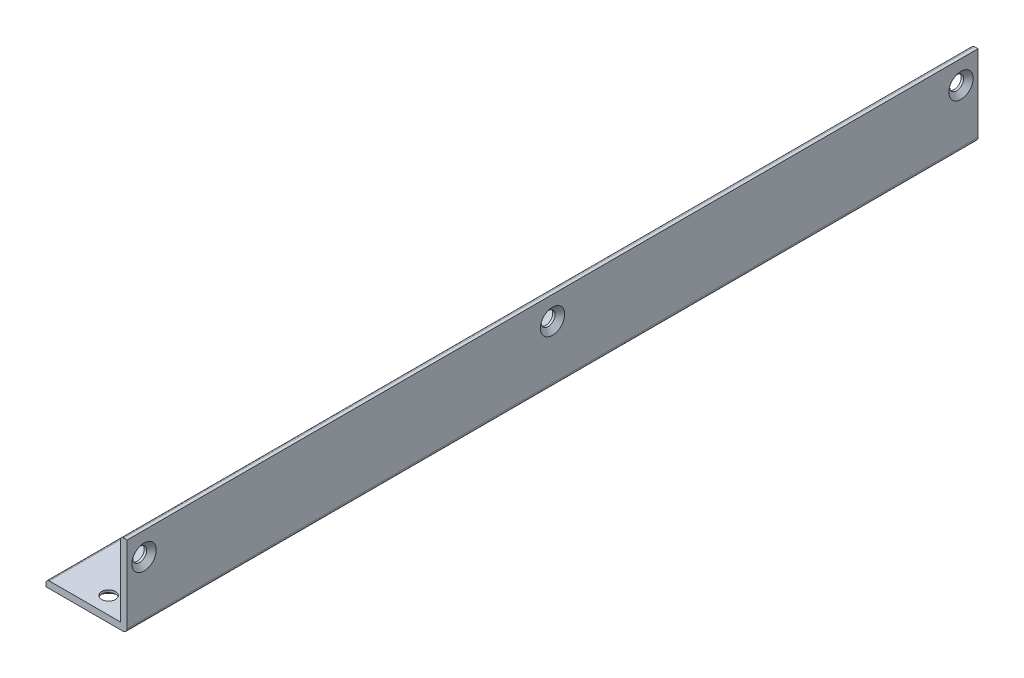
ISO-10303-21;
HEADER;
FILE_DESCRIPTION(('STEP AP214'),'2;1');
FILE_NAME('part.step','',(''),(''),'','','');
FILE_SCHEMA(('AUTOMOTIVE_DESIGN { 1 0 10303 214 1 1 1 1 }'));
ENDSEC;
DATA;
#1=APPLICATION_CONTEXT('core data for automotive mechanical design processes');
#2=APPLICATION_PROTOCOL_DEFINITION('international standard','automotive_design',2000,#1);
#3=PRODUCT_CONTEXT('',#1,'mechanical');
#4=PRODUCT('Part','Part','',(#3));
#5=PRODUCT_RELATED_PRODUCT_CATEGORY('part','',(#4));
#6=PRODUCT_DEFINITION_FORMATION('','',#4);
#7=PRODUCT_DEFINITION_CONTEXT('part definition',#1,'design');
#8=PRODUCT_DEFINITION('design','',#6,#7);
#9=PRODUCT_DEFINITION_SHAPE('','',#8);
#10=(LENGTH_UNIT() NAMED_UNIT(*) SI_UNIT(.MILLI.,.METRE.));
#11=(NAMED_UNIT(*) PLANE_ANGLE_UNIT() SI_UNIT($,.RADIAN.));
#12=(NAMED_UNIT(*) SI_UNIT($,.STERADIAN.) SOLID_ANGLE_UNIT());
#13=UNCERTAINTY_MEASURE_WITH_UNIT(LENGTH_MEASURE(1.E-05),#10,'distance_accuracy_value','');
#14=(GEOMETRIC_REPRESENTATION_CONTEXT(3) GLOBAL_UNCERTAINTY_ASSIGNED_CONTEXT((#13)) GLOBAL_UNIT_ASSIGNED_CONTEXT((#10,
#11,#12)) REPRESENTATION_CONTEXT('',''));
#15=CARTESIAN_POINT('',(0.,0.,0.));
#16=DIRECTION('',(0.,0.,1.));
#17=DIRECTION('',(1.,0.,0.));
#18=AXIS2_PLACEMENT_3D('',#15,#16,#17);
#19=CARTESIAN_POINT('',(8.73125,18.25625,-100.));
#20=DIRECTION('',(0.,0.,-1.));
#21=DIRECTION('',(-1.,0.,0.));
#22=AXIS2_PLACEMENT_3D('',#19,#20,#21);
#23=PLANE('',#22);
#24=DIRECTION('',(-1.,0.,0.));
#25=VECTOR('',#24,1.);
#26=CARTESIAN_POINT('',(7.14375000000001,1.5875,-100.));
#27=LINE('',#26,#25);
#28=CARTESIAN_POINT('',(7.93750000000001,1.5875,-100.));
#29=VERTEX_POINT('',#28);
#30=CARTESIAN_POINT('',(-8.73125,1.5875,-100.));
#31=VERTEX_POINT('',#30);
#32=EDGE_CURVE('E235',#29,#31,#27,.T.);
#33=ORIENTED_EDGE('',*,*,#32,.F.);
#34=DIRECTION('',(0.,-1.,0.));
#35=VECTOR('',#34,1.);
#36=CARTESIAN_POINT('',(7.9375,18.25625,-100.));
#37=LINE('',#36,#35);
#38=CARTESIAN_POINT('',(7.9375,18.25625,-100.));
#39=VERTEX_POINT('',#38);
#40=EDGE_CURVE('E146',#39,#29,#37,.T.);
#41=ORIENTED_EDGE('',*,*,#40,.F.);
#42=CARTESIAN_POINT('',(8.73125,18.25625,-100.));
#43=DIRECTION('',(0.,0.,1.));
#44=DIRECTION('',(-1.,0.,0.));
#45=AXIS2_PLACEMENT_3D('',#42,#43,#44);
#46=CIRCLE('',#45,0.793749999999999);
#47=CARTESIAN_POINT('',(8.73125,19.05,-100.));
#48=VERTEX_POINT('',#47);
#49=EDGE_CURVE('E232',#48,#39,#46,.T.);
#50=ORIENTED_EDGE('',*,*,#49,.F.);
#51=DIRECTION('',(-1.,0.,0.));
#52=VECTOR('',#51,1.);
#53=CARTESIAN_POINT('',(8.73125,19.05,-100.));
#54=LINE('',#53,#52);
#55=CARTESIAN_POINT('',(9.525,19.05,-100.));
#56=VERTEX_POINT('',#55);
#57=EDGE_CURVE('E230',#56,#48,#54,.T.);
#58=ORIENTED_EDGE('',*,*,#57,.F.);
#59=DIRECTION('',(0.,1.,0.));
#60=VECTOR('',#59,1.);
#61=CARTESIAN_POINT('',(9.525,0.,-100.));
#62=LINE('',#61,#60);
#63=CARTESIAN_POINT('',(9.525,1.,-100.));
#64=VERTEX_POINT('',#63);
#65=EDGE_CURVE('E228',#64,#56,#62,.T.);
#66=ORIENTED_EDGE('',*,*,#65,.F.);
#67=CARTESIAN_POINT('',(8.525,1.,-100.));
#68=DIRECTION('',(0.,0.,-1.));
#69=DIRECTION('',(-1.,0.,0.));
#70=AXIS2_PLACEMENT_3D('',#67,#68,#69);
#71=CIRCLE('',#70,1.);
#72=CARTESIAN_POINT('',(8.525,0.,-100.));
#73=VERTEX_POINT('',#72);
#74=EDGE_CURVE('E59',#64,#73,#71,.T.);
#75=ORIENTED_EDGE('',*,*,#74,.T.);
#76=DIRECTION('',(1.,0.,0.));
#77=VECTOR('',#76,1.);
#78=CARTESIAN_POINT('',(-9.525,0.,-100.));
#79=LINE('',#78,#77);
#80=CARTESIAN_POINT('',(-9.525,0.,-100.));
#81=VERTEX_POINT('',#80);
#82=EDGE_CURVE('E226',#81,#73,#79,.T.);
#83=ORIENTED_EDGE('',*,*,#82,.F.);
#84=DIRECTION('',(0.,-1.,0.));
#85=VECTOR('',#84,1.);
#86=CARTESIAN_POINT('',(-9.525,0.793749999999998,-100.));
#87=LINE('',#86,#85);
#88=CARTESIAN_POINT('',(-9.525,0.793749999999998,-100.));
#89=VERTEX_POINT('',#88);
#90=EDGE_CURVE('E223',#89,#81,#87,.T.);
#91=ORIENTED_EDGE('',*,*,#90,.F.);
#92=CARTESIAN_POINT('',(-8.73125,0.793749999999998,-100.));
#93=DIRECTION('',(0.,0.,1.));
#94=DIRECTION('',(-1.,0.,0.));
#95=AXIS2_PLACEMENT_3D('',#92,#93,#94);
#96=CIRCLE('',#95,0.793749999999998);
#97=EDGE_CURVE('E208',#31,#89,#96,.T.);
#98=ORIENTED_EDGE('',*,*,#97,.F.);
#99=EDGE_LOOP('',(#33,#41,#50,#58,#66,#75,#83,#91,#98));
#100=FACE_BOUND('',#99,.T.);
#101=ADVANCED_FACE('F35',(#100),#23,.T.);
#102=CARTESIAN_POINT('',(-9.525,0.793749999999998,100.));
#103=DIRECTION('',(1.,0.,0.));
#104=DIRECTION('',(0.,0.,-1.));
#105=AXIS2_PLACEMENT_3D('',#102,#103,#104);
#106=PLANE('',#105);
#107=ORIENTED_EDGE('',*,*,#90,.T.);
#108=DIRECTION('',(0.,0.,-1.));
#109=VECTOR('',#108,1.);
#110=CARTESIAN_POINT('',(-9.525,0.,100.));
#111=LINE('',#110,#109);
#112=CARTESIAN_POINT('',(-9.525,0.,100.));
#113=VERTEX_POINT('',#112);
#114=EDGE_CURVE('E254',#113,#81,#111,.T.);
#115=ORIENTED_EDGE('',*,*,#114,.F.);
#116=DIRECTION('',(0.,-1.,0.));
#117=VECTOR('',#116,1.);
#118=CARTESIAN_POINT('',(-9.525,0.793749999999998,100.));
#119=LINE('',#118,#117);
#120=CARTESIAN_POINT('',(-9.525,0.793749999999998,100.));
#121=VERTEX_POINT('',#120);
#122=EDGE_CURVE('E204',#121,#113,#119,.T.);
#123=ORIENTED_EDGE('',*,*,#122,.F.);
#124=DIRECTION('',(0.,0.,-1.));
#125=VECTOR('',#124,1.);
#126=CARTESIAN_POINT('',(-9.525,0.793749999999998,100.));
#127=LINE('',#126,#125);
#128=EDGE_CURVE('E222',#121,#89,#127,.T.);
#129=ORIENTED_EDGE('',*,*,#128,.T.);
#130=EDGE_LOOP('',(#107,#115,#123,#129));
#131=FACE_BOUND('',#130,.T.);
#132=ADVANCED_FACE('F289',(#131),#106,.F.);
#133=CARTESIAN_POINT('',(-9.525,0.,100.));
#134=DIRECTION('',(0.,1.,0.));
#135=DIRECTION('',(0.,0.,1.));
#136=AXIS2_PLACEMENT_3D('',#133,#134,#135);
#137=PLANE('',#136);
#138=CARTESIAN_POINT('',(0.275000000000001,0.,0.));
#139=DIRECTION('',(0.,-1.,0.));
#140=DIRECTION('',(0.,0.,-1.));
#141=AXIS2_PLACEMENT_3D('',#138,#139,#140);
#142=CIRCLE('',#141,2.8575);
#143=CARTESIAN_POINT('',(0.275000000000001,0.,-2.8575));
#144=VERTEX_POINT('',#143);
#145=EDGE_CURVE('E169',#144,#144,#142,.T.);
#146=ORIENTED_EDGE('',*,*,#145,.F.);
#147=EDGE_LOOP('',(#146));
#148=FACE_BOUND('',#147,.T.);
#149=CARTESIAN_POINT('',(1.185,0.,96.));
#150=DIRECTION('',(0.,-1.,0.));
#151=DIRECTION('',(0.,0.,-1.));
#152=AXIS2_PLACEMENT_3D('',#149,#150,#151);
#153=CIRCLE('',#152,2.8575);
#154=CARTESIAN_POINT('',(1.185,0.,93.1425));
#155=VERTEX_POINT('',#154);
#156=EDGE_CURVE('E190',#155,#155,#153,.T.);
#157=ORIENTED_EDGE('',*,*,#156,.F.);
#158=EDGE_LOOP('',(#157));
#159=FACE_BOUND('',#158,.T.);
#160=CARTESIAN_POINT('',(0.275000000000001,0.,-96.));
#161=DIRECTION('',(0.,-1.,0.));
#162=DIRECTION('',(0.,0.,-1.));
#163=AXIS2_PLACEMENT_3D('',#160,#161,#162);
#164=CIRCLE('',#163,2.8575);
#165=CARTESIAN_POINT('',(0.275000000000001,0.,-98.8575));
#166=VERTEX_POINT('',#165);
#167=EDGE_CURVE('E197',#166,#166,#164,.T.);
#168=ORIENTED_EDGE('',*,*,#167,.F.);
#169=EDGE_LOOP('',(#168));
#170=FACE_BOUND('',#169,.T.);
#171=ORIENTED_EDGE('',*,*,#82,.T.);
#172=DIRECTION('',(0.,0.,-1.));
#173=VECTOR('',#172,1.);
#174=CARTESIAN_POINT('',(8.525,0.,100.));
#175=LINE('',#174,#173);
#176=CARTESIAN_POINT('',(8.525,0.,100.));
#177=VERTEX_POINT('',#176);
#178=EDGE_CURVE('E44',#73,#177,#175,.F.);
#179=ORIENTED_EDGE('',*,*,#178,.T.);
#180=DIRECTION('',(1.,0.,0.));
#181=VECTOR('',#180,1.);
#182=CARTESIAN_POINT('',(-9.525,0.,100.));
#183=LINE('',#182,#181);
#184=EDGE_CURVE('E207',#113,#177,#183,.T.);
#185=ORIENTED_EDGE('',*,*,#184,.F.);
#186=ORIENTED_EDGE('',*,*,#114,.T.);
#187=EDGE_LOOP('',(#171,#179,#185,#186));
#188=FACE_BOUND('',#187,.T.);
#189=ADVANCED_FACE('F294',(#148,#159,#170,#188),#137,.F.);
#190=CARTESIAN_POINT('',(9.525,0.,100.));
#191=DIRECTION('',(-1.,0.,0.));
#192=DIRECTION('',(0.,0.,1.));
#193=AXIS2_PLACEMENT_3D('',#190,#191,#192);
#194=PLANE('',#193);
#195=CARTESIAN_POINT('',(9.525,13.5875,0.));
#196=DIRECTION('',(1.,0.,0.));
#197=DIRECTION('',(0.,0.,-1.));
#198=AXIS2_PLACEMENT_3D('',#195,#196,#197);
#199=CIRCLE('',#198,2.8575);
#200=CARTESIAN_POINT('',(9.525,13.5875,-2.8575));
#201=VERTEX_POINT('',#200);
#202=EDGE_CURVE('E163',#201,#201,#199,.T.);
#203=ORIENTED_EDGE('',*,*,#202,.F.);
#204=EDGE_LOOP('',(#203));
#205=FACE_BOUND('',#204,.T.);
#206=CARTESIAN_POINT('',(9.525,13.5875,96.));
#207=DIRECTION('',(1.,0.,0.));
#208=DIRECTION('',(0.,0.,-1.));
#209=AXIS2_PLACEMENT_3D('',#206,#207,#208);
#210=CIRCLE('',#209,2.8575);
#211=CARTESIAN_POINT('',(9.525,13.5875,93.1425));
#212=VERTEX_POINT('',#211);
#213=EDGE_CURVE('E176',#212,#212,#210,.T.);
#214=ORIENTED_EDGE('',*,*,#213,.F.);
#215=EDGE_LOOP('',(#214));
#216=FACE_BOUND('',#215,.T.);
#217=CARTESIAN_POINT('',(9.525,13.5875,-96.));
#218=DIRECTION('',(1.,0.,0.));
#219=DIRECTION('',(0.,0.,-1.));
#220=AXIS2_PLACEMENT_3D('',#217,#218,#219);
#221=CIRCLE('',#220,2.8575);
#222=CARTESIAN_POINT('',(9.525,13.5875,-98.8575));
#223=VERTEX_POINT('',#222);
#224=EDGE_CURVE('E183',#223,#223,#221,.T.);
#225=ORIENTED_EDGE('',*,*,#224,.F.);
#226=EDGE_LOOP('',(#225));
#227=FACE_BOUND('',#226,.T.);
#228=DIRECTION('',(0.,1.,0.));
#229=VECTOR('',#228,1.);
#230=CARTESIAN_POINT('',(9.525,0.,100.));
#231=LINE('',#230,#229);
#232=CARTESIAN_POINT('',(9.525,1.,100.));
#233=VERTEX_POINT('',#232);
#234=CARTESIAN_POINT('',(9.525,19.05,100.));
#235=VERTEX_POINT('',#234);
#236=EDGE_CURVE('E210',#233,#235,#231,.T.);
#237=ORIENTED_EDGE('',*,*,#236,.F.);
#238=DIRECTION('',(0.,0.,-1.));
#239=VECTOR('',#238,1.);
#240=CARTESIAN_POINT('',(9.525,1.,100.));
#241=LINE('',#240,#239);
#242=EDGE_CURVE('E257',#233,#64,#241,.T.);
#243=ORIENTED_EDGE('',*,*,#242,.T.);
#244=ORIENTED_EDGE('',*,*,#65,.T.);
#245=DIRECTION('',(0.,0.,-1.));
#246=VECTOR('',#245,1.);
#247=CARTESIAN_POINT('',(9.525,19.05,100.));
#248=LINE('',#247,#246);
#249=EDGE_CURVE('E251',#235,#56,#248,.T.);
#250=ORIENTED_EDGE('',*,*,#249,.F.);
#251=EDGE_LOOP('',(#237,#243,#244,#250));
#252=FACE_BOUND('',#251,.T.);
#253=ADVANCED_FACE('F319',(#205,#216,#227,#252),#194,.F.);
#254=CARTESIAN_POINT('',(8.73125,19.05,100.));
#255=DIRECTION('',(0.,-1.,0.));
#256=DIRECTION('',(0.,0.,-1.));
#257=AXIS2_PLACEMENT_3D('',#254,#255,#256);
#258=PLANE('',#257);
#259=ORIENTED_EDGE('',*,*,#57,.T.);
#260=DIRECTION('',(0.,0.,-1.));
#261=VECTOR('',#260,1.);
#262=CARTESIAN_POINT('',(8.73125,19.05,100.));
#263=LINE('',#262,#261);
#264=CARTESIAN_POINT('',(8.73125,19.05,100.));
#265=VERTEX_POINT('',#264);
#266=EDGE_CURVE('E248',#265,#48,#263,.T.);
#267=ORIENTED_EDGE('',*,*,#266,.F.);
#268=DIRECTION('',(-1.,0.,0.));
#269=VECTOR('',#268,1.);
#270=CARTESIAN_POINT('',(8.73125,19.05,100.));
#271=LINE('',#270,#269);
#272=EDGE_CURVE('E212',#235,#265,#271,.T.);
#273=ORIENTED_EDGE('',*,*,#272,.F.);
#274=ORIENTED_EDGE('',*,*,#249,.T.);
#275=EDGE_LOOP('',(#259,#267,#273,#274));
#276=FACE_BOUND('',#275,.T.);
#277=ADVANCED_FACE('F315',(#276),#258,.F.);
#278=CARTESIAN_POINT('',(8.73125,18.25625,100.));
#279=DIRECTION('',(0.,0.,-1.));
#280=DIRECTION('',(-1.,0.,0.));
#281=AXIS2_PLACEMENT_3D('',#278,#279,#280);
#282=CYLINDRICAL_SURFACE('',#281,0.793749999999999);
#283=ORIENTED_EDGE('',*,*,#49,.T.);
#284=DIRECTION('',(0.,0.,-1.));
#285=VECTOR('',#284,1.);
#286=CARTESIAN_POINT('',(7.9375,18.25625,100.));
#287=LINE('',#286,#285);
#288=CARTESIAN_POINT('',(7.9375,18.25625,100.));
#289=VERTEX_POINT('',#288);
#290=EDGE_CURVE('E246',#289,#39,#287,.T.);
#291=ORIENTED_EDGE('',*,*,#290,.F.);
#292=CARTESIAN_POINT('',(8.73125,18.25625,100.));
#293=DIRECTION('',(0.,0.,1.));
#294=DIRECTION('',(-1.,0.,0.));
#295=AXIS2_PLACEMENT_3D('',#292,#293,#294);
#296=CIRCLE('',#295,0.793749999999999);
#297=EDGE_CURVE('E214',#265,#289,#296,.T.);
#298=ORIENTED_EDGE('',*,*,#297,.F.);
#299=ORIENTED_EDGE('',*,*,#266,.T.);
#300=EDGE_LOOP('',(#283,#291,#298,#299));
#301=FACE_BOUND('',#300,.T.);
#302=ADVANCED_FACE('F312',(#301),#282,.T.);
#303=CARTESIAN_POINT('',(7.9375,18.25625,100.));
#304=DIRECTION('',(1.,0.,0.));
#305=DIRECTION('',(0.,1.,0.));
#306=AXIS2_PLACEMENT_3D('',#303,#304,#305);
#307=PLANE('',#306);
#308=ORIENTED_EDGE('',*,*,#40,.T.);
#309=DIRECTION('',(0.,0.,-1.));
#310=VECTOR('',#309,1.);
#311=CARTESIAN_POINT('',(7.93750000000001,1.5875,-75.));
#312=LINE('',#311,#310);
#313=CARTESIAN_POINT('',(7.93750000000001,1.5875,-75.));
#314=VERTEX_POINT('',#313);
#315=EDGE_CURVE('E128',#314,#29,#312,.T.);
#316=ORIENTED_EDGE('',*,*,#315,.F.);
#317=DIRECTION('',(0.,1.,0.));
#318=VECTOR('',#317,1.);
#319=CARTESIAN_POINT('',(7.93750000000001,6.5875,-75.));
#320=LINE('',#319,#318);
#321=CARTESIAN_POINT('',(7.93750000000001,2.38125,-75.));
#322=VERTEX_POINT('',#321);
#323=EDGE_CURVE('E135',#314,#322,#320,.T.);
#324=ORIENTED_EDGE('',*,*,#323,.T.);
#325=DIRECTION('',(0.,0.,-1.));
#326=VECTOR('',#325,1.);
#327=CARTESIAN_POINT('',(7.93750000000001,2.38125,100.));
#328=LINE('',#327,#326);
#329=CARTESIAN_POINT('',(7.93750000000001,2.38125,75.));
#330=VERTEX_POINT('',#329);
#331=EDGE_CURVE('E244',#330,#322,#328,.T.);
#332=ORIENTED_EDGE('',*,*,#331,.F.);
#333=DIRECTION('',(0.,1.,0.));
#334=VECTOR('',#333,1.);
#335=CARTESIAN_POINT('',(7.93750000000001,6.5875,75.));
#336=LINE('',#335,#334);
#337=CARTESIAN_POINT('',(7.93750000000001,1.5875,75.));
#338=VERTEX_POINT('',#337);
#339=EDGE_CURVE('E155',#338,#330,#336,.T.);
#340=ORIENTED_EDGE('',*,*,#339,.F.);
#341=DIRECTION('',(0.,0.,1.));
#342=VECTOR('',#341,1.);
#343=CARTESIAN_POINT('',(7.93750000000001,1.5875,75.));
#344=LINE('',#343,#342);
#345=CARTESIAN_POINT('',(7.93750000000001,1.5875,100.));
#346=VERTEX_POINT('',#345);
#347=EDGE_CURVE('E157',#338,#346,#344,.T.);
#348=ORIENTED_EDGE('',*,*,#347,.T.);
#349=DIRECTION('',(0.,-1.,0.));
#350=VECTOR('',#349,1.);
#351=CARTESIAN_POINT('',(7.9375,18.25625,100.));
#352=LINE('',#351,#350);
#353=EDGE_CURVE('E216',#289,#346,#352,.T.);
#354=ORIENTED_EDGE('',*,*,#353,.F.);
#355=ORIENTED_EDGE('',*,*,#290,.T.);
#356=EDGE_LOOP('',(#308,#316,#324,#332,#340,#348,#354,#355));
#357=FACE_BOUND('',#356,.T.);
#358=CARTESIAN_POINT('',(7.93750000000001,13.5875,-96.));
#359=DIRECTION('',(1.,0.,0.));
#360=DIRECTION('',(0.,1.,0.));
#361=AXIS2_PLACEMENT_3D('',#358,#359,#360);
#362=CIRCLE('',#361,1.63195);
#363=CARTESIAN_POINT('',(7.93750000000001,15.21945,-96.));
#364=VERTEX_POINT('',#363);
#365=EDGE_CURVE('E189',#364,#364,#362,.T.);
#366=ORIENTED_EDGE('',*,*,#365,.T.);
#367=EDGE_LOOP('',(#366));
#368=FACE_BOUND('',#367,.T.);
#369=CARTESIAN_POINT('',(7.93750000000001,13.5875,96.));
#370=DIRECTION('',(1.,0.,0.));
#371=DIRECTION('',(0.,1.,0.));
#372=AXIS2_PLACEMENT_3D('',#369,#370,#371);
#373=CIRCLE('',#372,1.63195);
#374=CARTESIAN_POINT('',(7.93750000000001,15.21945,96.));
#375=VERTEX_POINT('',#374);
#376=EDGE_CURVE('E182',#375,#375,#373,.T.);
#377=ORIENTED_EDGE('',*,*,#376,.T.);
#378=EDGE_LOOP('',(#377));
#379=FACE_BOUND('',#378,.T.);
#380=CARTESIAN_POINT('',(7.93750000000001,13.5875,0.));
#381=DIRECTION('',(1.,0.,0.));
#382=DIRECTION('',(0.,1.,0.));
#383=AXIS2_PLACEMENT_3D('',#380,#381,#382);
#384=CIRCLE('',#383,1.63194999999999);
#385=CARTESIAN_POINT('',(7.93750000000001,15.21945,0.));
#386=VERTEX_POINT('',#385);
#387=EDGE_CURVE('E39',#386,#386,#384,.T.);
#388=ORIENTED_EDGE('',*,*,#387,.T.);
#389=EDGE_LOOP('',(#388));
#390=FACE_BOUND('',#389,.T.);
#391=ADVANCED_FACE('F140',(#357,#368,#379,#390),#307,.F.);
#392=CARTESIAN_POINT('',(7.14375000000001,2.38125,100.));
#393=DIRECTION('',(0.,0.,-1.));
#394=DIRECTION('',(-1.,0.,0.));
#395=AXIS2_PLACEMENT_3D('',#392,#393,#394);
#396=CYLINDRICAL_SURFACE('',#395,0.793749999999999);
#397=ORIENTED_EDGE('',*,*,#331,.T.);
#398=CARTESIAN_POINT('',(7.14375000000001,2.38125,-75.));
#399=DIRECTION('',(0.,0.,1.));
#400=DIRECTION('',(1.,0.,0.));
#401=AXIS2_PLACEMENT_3D('',#398,#399,#400);
#402=CIRCLE('',#401,0.793749999999999);
#403=CARTESIAN_POINT('',(7.14375000000001,1.5875,-75.));
#404=VERTEX_POINT('',#403);
#405=EDGE_CURVE('E147',#322,#404,#402,.F.);
#406=ORIENTED_EDGE('',*,*,#405,.T.);
#407=DIRECTION('',(0.,0.,-1.));
#408=VECTOR('',#407,1.);
#409=CARTESIAN_POINT('',(7.14375000000001,1.5875,100.));
#410=LINE('',#409,#408);
#411=CARTESIAN_POINT('',(7.14375000000001,1.5875,75.));
#412=VERTEX_POINT('',#411);
#413=EDGE_CURVE('E131',#412,#404,#410,.T.);
#414=ORIENTED_EDGE('',*,*,#413,.F.);
#415=CARTESIAN_POINT('',(7.14375000000001,2.38125,75.));
#416=DIRECTION('',(0.,0.,-1.));
#417=DIRECTION('',(-1.,0.,0.));
#418=AXIS2_PLACEMENT_3D('',#415,#416,#417);
#419=CIRCLE('',#418,0.793749999999999);
#420=EDGE_CURVE('E160',#412,#330,#419,.F.);
#421=ORIENTED_EDGE('',*,*,#420,.T.);
#422=EDGE_LOOP('',(#397,#406,#414,#421));
#423=FACE_BOUND('',#422,.T.);
#424=ADVANCED_FACE('F306',(#423),#396,.F.);
#425=CARTESIAN_POINT('',(7.14375000000001,1.5875,100.));
#426=DIRECTION('',(0.,-1.,0.));
#427=DIRECTION('',(1.,0.,0.));
#428=AXIS2_PLACEMENT_3D('',#425,#426,#427);
#429=PLANE('',#428);
#430=ORIENTED_EDGE('',*,*,#32,.T.);
#431=DIRECTION('',(0.,0.,-1.));
#432=VECTOR('',#431,1.);
#433=CARTESIAN_POINT('',(-8.73125,1.5875,100.));
#434=LINE('',#433,#432);
#435=CARTESIAN_POINT('',(-8.73125,1.5875,100.));
#436=VERTEX_POINT('',#435);
#437=EDGE_CURVE('E240',#436,#31,#434,.T.);
#438=ORIENTED_EDGE('',*,*,#437,.F.);
#439=DIRECTION('',(-1.,0.,0.));
#440=VECTOR('',#439,1.);
#441=CARTESIAN_POINT('',(7.14375000000001,1.5875,100.));
#442=LINE('',#441,#440);
#443=EDGE_CURVE('E218',#346,#436,#442,.T.);
#444=ORIENTED_EDGE('',*,*,#443,.F.);
#445=ORIENTED_EDGE('',*,*,#347,.F.);
#446=DIRECTION('',(1.,0.,0.));
#447=VECTOR('',#446,1.);
#448=CARTESIAN_POINT('',(2.9375,1.5875,75.));
#449=LINE('',#448,#447);
#450=EDGE_CURVE('E153',#412,#338,#449,.T.);
#451=ORIENTED_EDGE('',*,*,#450,.F.);
#452=ORIENTED_EDGE('',*,*,#413,.T.);
#453=DIRECTION('',(1.,0.,0.));
#454=VECTOR('',#453,1.);
#455=CARTESIAN_POINT('',(2.9375,1.5875,-75.));
#456=LINE('',#455,#454);
#457=EDGE_CURVE('E124',#404,#314,#456,.T.);
#458=ORIENTED_EDGE('',*,*,#457,.T.);
#459=ORIENTED_EDGE('',*,*,#315,.T.);
#460=EDGE_LOOP('',(#430,#438,#444,#445,#451,#452,#458,#459));
#461=FACE_BOUND('',#460,.T.);
#462=CARTESIAN_POINT('',(0.275000000000001,1.5875,-96.));
#463=DIRECTION('',(0.,-1.,0.));
#464=DIRECTION('',(1.,0.,0.));
#465=AXIS2_PLACEMENT_3D('',#462,#463,#464);
#466=CIRCLE('',#465,1.63195);
#467=CARTESIAN_POINT('',(1.90695,1.5875,-96.));
#468=VERTEX_POINT('',#467);
#469=EDGE_CURVE('E203',#468,#468,#466,.T.);
#470=ORIENTED_EDGE('',*,*,#469,.T.);
#471=EDGE_LOOP('',(#470));
#472=FACE_BOUND('',#471,.T.);
#473=CARTESIAN_POINT('',(1.185,1.5875,96.));
#474=DIRECTION('',(0.,-1.,0.));
#475=DIRECTION('',(1.,0.,0.));
#476=AXIS2_PLACEMENT_3D('',#473,#474,#475);
#477=CIRCLE('',#476,1.63195);
#478=CARTESIAN_POINT('',(2.81695,1.5875,96.));
#479=VERTEX_POINT('',#478);
#480=EDGE_CURVE('E196',#479,#479,#477,.T.);
#481=ORIENTED_EDGE('',*,*,#480,.T.);
#482=EDGE_LOOP('',(#481));
#483=FACE_BOUND('',#482,.T.);
#484=CARTESIAN_POINT('',(0.275000000000001,1.5875,0.));
#485=DIRECTION('',(0.,-1.,0.));
#486=DIRECTION('',(1.,0.,0.));
#487=AXIS2_PLACEMENT_3D('',#484,#485,#486);
#488=CIRCLE('',#487,1.63194999999999);
#489=CARTESIAN_POINT('',(1.90694999999999,1.5875,0.));
#490=VERTEX_POINT('',#489);
#491=EDGE_CURVE('E175',#490,#490,#488,.T.);
#492=ORIENTED_EDGE('',*,*,#491,.T.);
#493=EDGE_LOOP('',(#492));
#494=FACE_BOUND('',#493,.T.);
#495=ADVANCED_FACE('F126',(#461,#472,#483,#494),#429,.F.);
#496=CARTESIAN_POINT('',(-8.73125,0.793749999999998,100.));
#497=DIRECTION('',(0.,0.,-1.));
#498=DIRECTION('',(-1.,0.,0.));
#499=AXIS2_PLACEMENT_3D('',#496,#497,#498);
#500=CYLINDRICAL_SURFACE('',#499,0.793749999999998);
#501=ORIENTED_EDGE('',*,*,#97,.T.);
#502=ORIENTED_EDGE('',*,*,#128,.F.);
#503=CARTESIAN_POINT('',(-8.73125,0.793749999999998,100.));
#504=DIRECTION('',(0.,0.,1.));
#505=DIRECTION('',(-1.,0.,0.));
#506=AXIS2_PLACEMENT_3D('',#503,#504,#505);
#507=CIRCLE('',#506,0.793749999999998);
#508=EDGE_CURVE('E220',#436,#121,#507,.T.);
#509=ORIENTED_EDGE('',*,*,#508,.F.);
#510=ORIENTED_EDGE('',*,*,#437,.T.);
#511=EDGE_LOOP('',(#501,#502,#509,#510));
#512=FACE_BOUND('',#511,.T.);
#513=ADVANCED_FACE('F300',(#512),#500,.T.);
#514=CARTESIAN_POINT('',(8.73125,18.25625,100.));
#515=DIRECTION('',(0.,0.,-1.));
#516=DIRECTION('',(-1.,0.,0.));
#517=AXIS2_PLACEMENT_3D('',#514,#515,#516);
#518=PLANE('',#517);
#519=ORIENTED_EDGE('',*,*,#353,.T.);
#520=ORIENTED_EDGE('',*,*,#443,.T.);
#521=ORIENTED_EDGE('',*,*,#508,.T.);
#522=ORIENTED_EDGE('',*,*,#122,.T.);
#523=ORIENTED_EDGE('',*,*,#184,.T.);
#524=CARTESIAN_POINT('',(8.525,1.,100.));
#525=DIRECTION('',(0.,0.,-1.));
#526=DIRECTION('',(-1.,0.,0.));
#527=AXIS2_PLACEMENT_3D('',#524,#525,#526);
#528=CIRCLE('',#527,1.);
#529=EDGE_CURVE('E11',#177,#233,#528,.F.);
#530=ORIENTED_EDGE('',*,*,#529,.T.);
#531=ORIENTED_EDGE('',*,*,#236,.T.);
#532=ORIENTED_EDGE('',*,*,#272,.T.);
#533=ORIENTED_EDGE('',*,*,#297,.T.);
#534=EDGE_LOOP('',(#519,#520,#521,#522,#523,#530,#531,#532,#533));
#535=FACE_BOUND('',#534,.T.);
#536=ADVANCED_FACE('F298',(#535),#518,.F.);
#537=CARTESIAN_POINT('',(0.275000000000001,0.,-96.));
#538=DIRECTION('',(0.,-1.,0.));
#539=DIRECTION('',(0.,0.,-1.));
#540=AXIS2_PLACEMENT_3D('',#537,#538,#539);
#541=CYLINDRICAL_SURFACE('',#540,1.63195);
#542=CARTESIAN_POINT('',(0.275000000000001,1.02835855298932,-96.));
#543=DIRECTION('',(0.,-1.,0.));
#544=DIRECTION('',(0.,0.,-1.));
#545=AXIS2_PLACEMENT_3D('',#542,#543,#544);
#546=CIRCLE('',#545,1.63195);
#547=CARTESIAN_POINT('',(0.275000000000001,1.02835855298932,-97.63195));
#548=VERTEX_POINT('',#547);
#549=EDGE_CURVE('E200',#548,#548,#546,.T.);
#550=ORIENTED_EDGE('',*,*,#549,.T.);
#551=EDGE_LOOP('',(#550));
#552=FACE_BOUND('',#551,.T.);
#553=ORIENTED_EDGE('',*,*,#469,.F.);
#554=EDGE_LOOP('',(#553));
#555=FACE_BOUND('',#554,.T.);
#556=ADVANCED_FACE('F411',(#552,#555),#541,.F.);
#557=CARTESIAN_POINT('',(0.275000000000001,0.,-96.));
#558=DIRECTION('',(0.,-1.,0.));
#559=DIRECTION('',(0.,0.,-1.));
#560=AXIS2_PLACEMENT_3D('',#557,#558,#559);
#561=CONICAL_SURFACE('',#560,2.8575,0.872664625997165);
#562=ORIENTED_EDGE('',*,*,#549,.F.);
#563=EDGE_LOOP('',(#562));
#564=FACE_BOUND('',#563,.T.);
#565=ORIENTED_EDGE('',*,*,#167,.T.);
#566=EDGE_LOOP('',(#565));
#567=FACE_BOUND('',#566,.T.);
#568=ADVANCED_FACE('F408',(#564,#567),#561,.F.);
#569=CARTESIAN_POINT('',(1.185,0.,96.));
#570=DIRECTION('',(0.,-1.,0.));
#571=DIRECTION('',(0.,0.,-1.));
#572=AXIS2_PLACEMENT_3D('',#569,#570,#571);
#573=CYLINDRICAL_SURFACE('',#572,1.63195);
#574=CARTESIAN_POINT('',(1.185,1.02835855298932,96.));
#575=DIRECTION('',(0.,-1.,0.));
#576=DIRECTION('',(0.,0.,-1.));
#577=AXIS2_PLACEMENT_3D('',#574,#575,#576);
#578=CIRCLE('',#577,1.63195);
#579=CARTESIAN_POINT('',(1.185,1.02835855298932,94.36805));
#580=VERTEX_POINT('',#579);
#581=EDGE_CURVE('E193',#580,#580,#578,.T.);
#582=ORIENTED_EDGE('',*,*,#581,.T.);
#583=EDGE_LOOP('',(#582));
#584=FACE_BOUND('',#583,.T.);
#585=ORIENTED_EDGE('',*,*,#480,.F.);
#586=EDGE_LOOP('',(#585));
#587=FACE_BOUND('',#586,.T.);
#588=ADVANCED_FACE('F404',(#584,#587),#573,.F.);
#589=CARTESIAN_POINT('',(1.185,0.,96.));
#590=DIRECTION('',(0.,-1.,0.));
#591=DIRECTION('',(0.,0.,-1.));
#592=AXIS2_PLACEMENT_3D('',#589,#590,#591);
#593=CONICAL_SURFACE('',#592,2.8575,0.872664625997165);
#594=ORIENTED_EDGE('',*,*,#581,.F.);
#595=EDGE_LOOP('',(#594));
#596=FACE_BOUND('',#595,.T.);
#597=ORIENTED_EDGE('',*,*,#156,.T.);
#598=EDGE_LOOP('',(#597));
#599=FACE_BOUND('',#598,.T.);
#600=ADVANCED_FACE('F397',(#596,#599),#593,.F.);
#601=CARTESIAN_POINT('',(9.525,13.5875,-96.));
#602=DIRECTION('',(1.,0.,0.));
#603=DIRECTION('',(0.,0.,-1.));
#604=AXIS2_PLACEMENT_3D('',#601,#602,#603);
#605=CYLINDRICAL_SURFACE('',#604,1.63195);
#606=CARTESIAN_POINT('',(8.49664144701068,13.5875,-96.));
#607=DIRECTION('',(1.,0.,0.));
#608=DIRECTION('',(0.,0.,-1.));
#609=AXIS2_PLACEMENT_3D('',#606,#607,#608);
#610=CIRCLE('',#609,1.63195);
#611=CARTESIAN_POINT('',(8.49664144701068,13.5875,-97.63195));
#612=VERTEX_POINT('',#611);
#613=EDGE_CURVE('E186',#612,#612,#610,.T.);
#614=ORIENTED_EDGE('',*,*,#613,.T.);
#615=EDGE_LOOP('',(#614));
#616=FACE_BOUND('',#615,.T.);
#617=ORIENTED_EDGE('',*,*,#365,.F.);
#618=EDGE_LOOP('',(#617));
#619=FACE_BOUND('',#618,.T.);
#620=ADVANCED_FACE('F388',(#616,#619),#605,.F.);
#621=CARTESIAN_POINT('',(9.525,13.5875,-96.));
#622=DIRECTION('',(1.,0.,0.));
#623=DIRECTION('',(0.,0.,-1.));
#624=AXIS2_PLACEMENT_3D('',#621,#622,#623);
#625=CONICAL_SURFACE('',#624,2.8575,0.872664625997165);
#626=ORIENTED_EDGE('',*,*,#613,.F.);
#627=EDGE_LOOP('',(#626));
#628=FACE_BOUND('',#627,.T.);
#629=ORIENTED_EDGE('',*,*,#224,.T.);
#630=EDGE_LOOP('',(#629));
#631=FACE_BOUND('',#630,.T.);
#632=ADVANCED_FACE('F385',(#628,#631),#625,.F.);
#633=CARTESIAN_POINT('',(9.525,13.5875,96.));
#634=DIRECTION('',(1.,0.,0.));
#635=DIRECTION('',(0.,0.,-1.));
#636=AXIS2_PLACEMENT_3D('',#633,#634,#635);
#637=CYLINDRICAL_SURFACE('',#636,1.63195);
#638=CARTESIAN_POINT('',(8.49664144701068,13.5875,96.));
#639=DIRECTION('',(1.,0.,0.));
#640=DIRECTION('',(0.,0.,-1.));
#641=AXIS2_PLACEMENT_3D('',#638,#639,#640);
#642=CIRCLE('',#641,1.63195);
#643=CARTESIAN_POINT('',(8.49664144701068,13.5875,94.36805));
#644=VERTEX_POINT('',#643);
#645=EDGE_CURVE('E179',#644,#644,#642,.T.);
#646=ORIENTED_EDGE('',*,*,#645,.T.);
#647=EDGE_LOOP('',(#646));
#648=FACE_BOUND('',#647,.T.);
#649=ORIENTED_EDGE('',*,*,#376,.F.);
#650=EDGE_LOOP('',(#649));
#651=FACE_BOUND('',#650,.T.);
#652=ADVANCED_FACE('F387',(#648,#651),#637,.F.);
#653=CARTESIAN_POINT('',(9.525,13.5875,96.));
#654=DIRECTION('',(1.,0.,0.));
#655=DIRECTION('',(0.,0.,-1.));
#656=AXIS2_PLACEMENT_3D('',#653,#654,#655);
#657=CONICAL_SURFACE('',#656,2.8575,0.872664625997165);
#658=ORIENTED_EDGE('',*,*,#645,.F.);
#659=EDGE_LOOP('',(#658));
#660=FACE_BOUND('',#659,.T.);
#661=ORIENTED_EDGE('',*,*,#213,.T.);
#662=EDGE_LOOP('',(#661));
#663=FACE_BOUND('',#662,.T.);
#664=ADVANCED_FACE('F285',(#660,#663),#657,.F.);
#665=CARTESIAN_POINT('',(8.525,1.,100.));
#666=DIRECTION('',(0.,0.,-1.));
#667=DIRECTION('',(-1.,0.,0.));
#668=AXIS2_PLACEMENT_3D('',#665,#666,#667);
#669=CYLINDRICAL_SURFACE('',#668,1.);
#670=ORIENTED_EDGE('',*,*,#529,.F.);
#671=ORIENTED_EDGE('',*,*,#178,.F.);
#672=ORIENTED_EDGE('',*,*,#74,.F.);
#673=ORIENTED_EDGE('',*,*,#242,.F.);
#674=EDGE_LOOP('',(#670,#671,#672,#673));
#675=FACE_BOUND('',#674,.T.);
#676=ADVANCED_FACE('F37',(#675),#669,.T.);
#677=CARTESIAN_POINT('',(0.275000000000001,0.,0.));
#678=DIRECTION('',(0.,-1.,0.));
#679=DIRECTION('',(0.,0.,-1.));
#680=AXIS2_PLACEMENT_3D('',#677,#678,#679);
#681=CYLINDRICAL_SURFACE('',#680,1.63194999999999);
#682=CARTESIAN_POINT('',(0.275000000000001,1.02835855298933,0.));
#683=DIRECTION('',(0.,-1.,0.));
#684=DIRECTION('',(0.,0.,-1.));
#685=AXIS2_PLACEMENT_3D('',#682,#683,#684);
#686=CIRCLE('',#685,1.63194999999999);
#687=CARTESIAN_POINT('',(0.275000000000001,1.02835855298933,-1.63194999999999));
#688=VERTEX_POINT('',#687);
#689=EDGE_CURVE('E172',#688,#688,#686,.T.);
#690=ORIENTED_EDGE('',*,*,#689,.T.);
#691=EDGE_LOOP('',(#690));
#692=FACE_BOUND('',#691,.T.);
#693=ORIENTED_EDGE('',*,*,#491,.F.);
#694=EDGE_LOOP('',(#693));
#695=FACE_BOUND('',#694,.T.);
#696=ADVANCED_FACE('F273',(#692,#695),#681,.F.);
#697=CARTESIAN_POINT('',(0.275000000000001,0.,0.));
#698=DIRECTION('',(0.,-1.,0.));
#699=DIRECTION('',(0.,0.,-1.));
#700=AXIS2_PLACEMENT_3D('',#697,#698,#699);
#701=CONICAL_SURFACE('',#700,2.8575,0.872664625997162);
#702=ORIENTED_EDGE('',*,*,#689,.F.);
#703=EDGE_LOOP('',(#702));
#704=FACE_BOUND('',#703,.T.);
#705=ORIENTED_EDGE('',*,*,#145,.T.);
#706=EDGE_LOOP('',(#705));
#707=FACE_BOUND('',#706,.T.);
#708=ADVANCED_FACE('F275',(#704,#707),#701,.F.);
#709=CARTESIAN_POINT('',(9.525,13.5875,0.));
#710=DIRECTION('',(1.,0.,0.));
#711=DIRECTION('',(0.,0.,-1.));
#712=AXIS2_PLACEMENT_3D('',#709,#710,#711);
#713=CYLINDRICAL_SURFACE('',#712,1.63194999999999);
#714=CARTESIAN_POINT('',(8.49664144701067,13.5875,0.));
#715=DIRECTION('',(1.,0.,0.));
#716=DIRECTION('',(0.,0.,-1.));
#717=AXIS2_PLACEMENT_3D('',#714,#715,#716);
#718=CIRCLE('',#717,1.63194999999999);
#719=CARTESIAN_POINT('',(8.49664144701067,13.5875,-1.63194999999999));
#720=VERTEX_POINT('',#719);
#721=EDGE_CURVE('E166',#720,#720,#718,.T.);
#722=ORIENTED_EDGE('',*,*,#721,.T.);
#723=EDGE_LOOP('',(#722));
#724=FACE_BOUND('',#723,.T.);
#725=ORIENTED_EDGE('',*,*,#387,.F.);
#726=EDGE_LOOP('',(#725));
#727=FACE_BOUND('',#726,.T.);
#728=ADVANCED_FACE('F282',(#724,#727),#713,.F.);
#729=CARTESIAN_POINT('',(9.525,13.5875,0.));
#730=DIRECTION('',(1.,0.,0.));
#731=DIRECTION('',(0.,0.,-1.));
#732=AXIS2_PLACEMENT_3D('',#729,#730,#731);
#733=CONICAL_SURFACE('',#732,2.8575,0.872664625997162);
#734=ORIENTED_EDGE('',*,*,#721,.F.);
#735=EDGE_LOOP('',(#734));
#736=FACE_BOUND('',#735,.T.);
#737=ORIENTED_EDGE('',*,*,#202,.T.);
#738=EDGE_LOOP('',(#737));
#739=FACE_BOUND('',#738,.T.);
#740=ADVANCED_FACE('F359',(#736,#739),#733,.F.);
#741=CARTESIAN_POINT('',(0.,0.,75.));
#742=DIRECTION('',(0.,0.,-1.));
#743=DIRECTION('',(-1.,0.,0.));
#744=AXIS2_PLACEMENT_3D('',#741,#742,#743);
#745=PLANE('',#744);
#746=ORIENTED_EDGE('',*,*,#450,.T.);
#747=ORIENTED_EDGE('',*,*,#339,.T.);
#748=ORIENTED_EDGE('',*,*,#420,.F.);
#749=EDGE_LOOP('',(#746,#747,#748));
#750=FACE_BOUND('',#749,.T.);
#751=ADVANCED_FACE('F357',(#750),#745,.F.);
#752=CARTESIAN_POINT('',(0.,0.,-75.));
#753=DIRECTION('',(0.,0.,1.));
#754=DIRECTION('',(-1.,0.,0.));
#755=AXIS2_PLACEMENT_3D('',#752,#753,#754);
#756=PLANE('',#755);
#757=ORIENTED_EDGE('',*,*,#323,.F.);
#758=ORIENTED_EDGE('',*,*,#457,.F.);
#759=ORIENTED_EDGE('',*,*,#405,.F.);
#760=EDGE_LOOP('',(#757,#758,#759));
#761=FACE_BOUND('',#760,.T.);
#762=ADVANCED_FACE('F149',(#761),#756,.F.);
#763=CLOSED_SHELL('',(#101,#132,#189,#253,#277,#302,#391,#424,#495,#513,#536,#556,#568,#588,
#600,#620,#632,#652,#664,#676,#696,#708,#728,#740,#751,#762));
#764=MANIFOLD_SOLID_BREP('B2',#763);
#765=ADVANCED_BREP_SHAPE_REPRESENTATION('',(#18,#764),#14);
#766=SHAPE_DEFINITION_REPRESENTATION(#9,#765);
ENDSEC;
END-ISO-10303-21;
